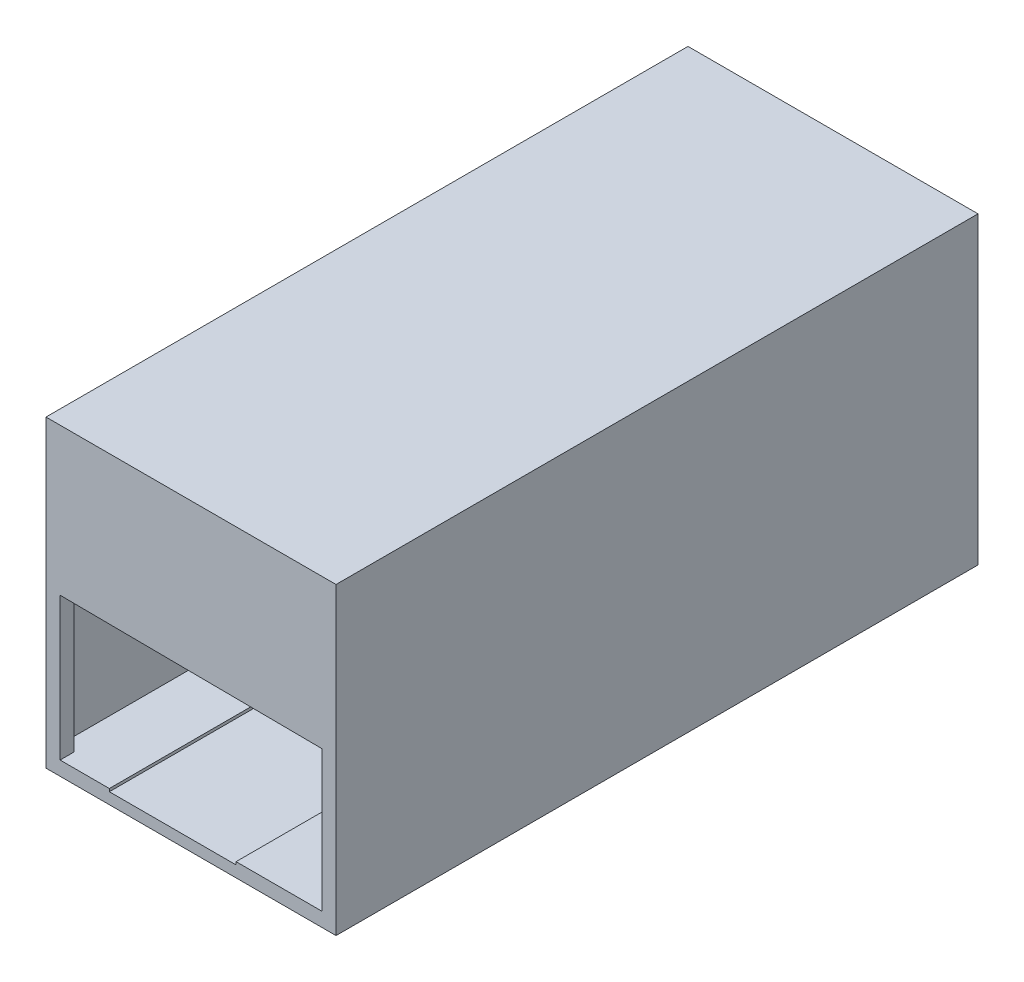
ISO-10303-21;
HEADER;
FILE_DESCRIPTION(('STEP AP214'),'2;1');
FILE_NAME('part.step','',(''),(''),'','','');
FILE_SCHEMA(('AUTOMOTIVE_DESIGN { 1 0 10303 214 1 1 1 1 }'));
ENDSEC;
DATA;
#1=APPLICATION_CONTEXT('core data for automotive mechanical design processes');
#2=APPLICATION_PROTOCOL_DEFINITION('international standard','automotive_design',2000,#1);
#3=PRODUCT_CONTEXT('',#1,'mechanical');
#4=PRODUCT('Part','Part','',(#3));
#5=PRODUCT_RELATED_PRODUCT_CATEGORY('part','',(#4));
#6=PRODUCT_DEFINITION_FORMATION('','',#4);
#7=PRODUCT_DEFINITION_CONTEXT('part definition',#1,'design');
#8=PRODUCT_DEFINITION('design','',#6,#7);
#9=PRODUCT_DEFINITION_SHAPE('','',#8);
#10=(LENGTH_UNIT() NAMED_UNIT(*) SI_UNIT(.MILLI.,.METRE.));
#11=(NAMED_UNIT(*) PLANE_ANGLE_UNIT() SI_UNIT($,.RADIAN.));
#12=(NAMED_UNIT(*) SI_UNIT($,.STERADIAN.) SOLID_ANGLE_UNIT());
#13=UNCERTAINTY_MEASURE_WITH_UNIT(LENGTH_MEASURE(1.E-05),#10,'distance_accuracy_value','');
#14=(GEOMETRIC_REPRESENTATION_CONTEXT(3) GLOBAL_UNCERTAINTY_ASSIGNED_CONTEXT((#13)) GLOBAL_UNIT_ASSIGNED_CONTEXT((#10,
#11,#12)) REPRESENTATION_CONTEXT('',''));
#15=CARTESIAN_POINT('',(0.,0.,0.));
#16=DIRECTION('',(0.,0.,1.));
#17=DIRECTION('',(1.,0.,0.));
#18=AXIS2_PLACEMENT_3D('',#15,#16,#17);
#19=CARTESIAN_POINT('',(-51.3,-49.,-369.882909471155));
#20=DIRECTION('',(0.,-1.,0.));
#21=DIRECTION('',(0.,0.,-1.));
#22=AXIS2_PLACEMENT_3D('',#19,#20,#21);
#23=PLANE('',#22);
#24=DIRECTION('',(1.,0.,0.));
#25=VECTOR('',#24,1.);
#26=CARTESIAN_POINT('',(0.,-49.,0.));
#27=LINE('',#26,#25);
#28=CARTESIAN_POINT('',(-46.5,-49.,0.));
#29=VERTEX_POINT('',#28);
#30=CARTESIAN_POINT('',(-29.,-49.,0.));
#31=VERTEX_POINT('',#30);
#32=EDGE_CURVE('E209',#29,#31,#27,.T.);
#33=ORIENTED_EDGE('',*,*,#32,.T.);
#34=DIRECTION('',(0.,0.,1.));
#35=VECTOR('',#34,1.);
#36=CARTESIAN_POINT('',(-29.,-49.,0.));
#37=LINE('',#36,#35);
#38=CARTESIAN_POINT('',(-29.,-49.,-228.));
#39=VERTEX_POINT('',#38);
#40=EDGE_CURVE('E390',#39,#31,#37,.T.);
#41=ORIENTED_EDGE('',*,*,#40,.F.);
#42=DIRECTION('',(-1.,0.,0.));
#43=VECTOR('',#42,1.);
#44=CARTESIAN_POINT('',(0.,-49.,-228.));
#45=LINE('',#44,#43);
#46=CARTESIAN_POINT('',(-46.5,-49.,-228.));
#47=VERTEX_POINT('',#46);
#48=EDGE_CURVE('E237',#39,#47,#45,.T.);
#49=ORIENTED_EDGE('',*,*,#48,.T.);
#50=DIRECTION('',(0.,0.,1.));
#51=VECTOR('',#50,1.);
#52=CARTESIAN_POINT('',(-46.5,-49.,-444.));
#53=LINE('',#52,#51);
#54=CARTESIAN_POINT('',(-46.5,-49.,-223.));
#55=VERTEX_POINT('',#54);
#56=EDGE_CURVE('E68',#47,#55,#53,.T.);
#57=ORIENTED_EDGE('',*,*,#56,.T.);
#58=DIRECTION('',(1.,0.,0.));
#59=VECTOR('',#58,1.);
#60=CARTESIAN_POINT('',(-51.3,-49.,-223.));
#61=LINE('',#60,#59);
#62=CARTESIAN_POINT('',(-51.3,-49.,-223.));
#63=VERTEX_POINT('',#62);
#64=EDGE_CURVE('E282',#63,#55,#61,.T.);
#65=ORIENTED_EDGE('',*,*,#64,.F.);
#66=DIRECTION('',(0.,0.,1.));
#67=VECTOR('',#66,1.);
#68=CARTESIAN_POINT('',(-51.3,-49.,-369.882909471155));
#69=LINE('',#68,#67);
#70=CARTESIAN_POINT('',(-51.3,-49.,-5.));
#71=VERTEX_POINT('',#70);
#72=EDGE_CURVE('E289',#63,#71,#69,.T.);
#73=ORIENTED_EDGE('',*,*,#72,.T.);
#74=DIRECTION('',(1.,0.,0.));
#75=VECTOR('',#74,1.);
#76=CARTESIAN_POINT('',(-51.3,-49.,-5.));
#77=LINE('',#76,#75);
#78=CARTESIAN_POINT('',(-46.5,-49.,-4.99999999999995));
#79=VERTEX_POINT('',#78);
#80=EDGE_CURVE('E276',#71,#79,#77,.T.);
#81=ORIENTED_EDGE('',*,*,#80,.T.);
#82=EDGE_CURVE('E221',#79,#29,#53,.T.);
#83=ORIENTED_EDGE('',*,*,#82,.T.);
#84=EDGE_LOOP('',(#33,#41,#49,#57,#65,#73,#81,#83));
#85=FACE_BOUND('',#84,.T.);
#86=ADVANCED_FACE('F43',(#85),#23,.F.);
#87=CARTESIAN_POINT('',(0.,0.,-223.));
#88=DIRECTION('',(0.,0.,-1.));
#89=DIRECTION('',(-1.,0.,0.));
#90=AXIS2_PLACEMENT_3D('',#87,#88,#89);
#91=PLANE('',#90);
#92=ORIENTED_EDGE('',*,*,#64,.T.);
#93=DIRECTION('',(0.,1.,0.));
#94=VECTOR('',#93,1.);
#95=CARTESIAN_POINT('',(-46.5,0.,-223.));
#96=LINE('',#95,#94);
#97=CARTESIAN_POINT('',(-46.5,1.70847564087544,-223.));
#98=VERTEX_POINT('',#97);
#99=EDGE_CURVE('E259',#55,#98,#96,.T.);
#100=ORIENTED_EDGE('',*,*,#99,.T.);
#101=DIRECTION('',(0.999970984166516,-0.00761779660069039,0.));
#102=VECTOR('',#101,1.);
#103=CARTESIAN_POINT('',(0.0103160089287741,1.3541592328997,-223.));
#104=LINE('',#103,#102);
#105=CARTESIAN_POINT('',(46.5,1.00000000000001,-223.));
#106=VERTEX_POINT('',#105);
#107=EDGE_CURVE('E251',#98,#106,#104,.T.);
#108=ORIENTED_EDGE('',*,*,#107,.T.);
#109=DIRECTION('',(0.,-1.,0.));
#110=VECTOR('',#109,1.);
#111=CARTESIAN_POINT('',(46.5,0.,-223.));
#112=LINE('',#111,#110);
#113=CARTESIAN_POINT('',(46.5,-49.,-223.));
#114=VERTEX_POINT('',#113);
#115=EDGE_CURVE('E243',#106,#114,#112,.T.);
#116=ORIENTED_EDGE('',*,*,#115,.T.);
#117=CARTESIAN_POINT('',(51.3,-49.,-223.));
#118=VERTEX_POINT('',#117);
#119=EDGE_CURVE('E272',#114,#118,#61,.T.);
#120=ORIENTED_EDGE('',*,*,#119,.T.);
#121=DIRECTION('',(0.,1.,0.));
#122=VECTOR('',#121,1.);
#123=CARTESIAN_POINT('',(51.3,-49.,-223.));
#124=LINE('',#123,#122);
#125=CARTESIAN_POINT('',(51.3,49.,-223.));
#126=VERTEX_POINT('',#125);
#127=EDGE_CURVE('E295',#118,#126,#124,.T.);
#128=ORIENTED_EDGE('',*,*,#127,.T.);
#129=DIRECTION('',(-1.,0.,0.));
#130=VECTOR('',#129,1.);
#131=CARTESIAN_POINT('',(-0.803988536882182,49.,-223.));
#132=LINE('',#131,#130);
#133=CARTESIAN_POINT('',(-51.3,49.,-223.));
#134=VERTEX_POINT('',#133);
#135=EDGE_CURVE('E291',#126,#134,#132,.T.);
#136=ORIENTED_EDGE('',*,*,#135,.T.);
#137=DIRECTION('',(0.,-1.,0.));
#138=VECTOR('',#137,1.);
#139=CARTESIAN_POINT('',(-51.3,49.,-223.));
#140=LINE('',#139,#138);
#141=EDGE_CURVE('E286',#134,#63,#140,.T.);
#142=ORIENTED_EDGE('',*,*,#141,.T.);
#143=EDGE_LOOP('',(#92,#100,#108,#116,#120,#128,#136,#142));
#144=FACE_BOUND('',#143,.T.);
#145=ADVANCED_FACE('F357',(#144),#91,.F.);
#146=CARTESIAN_POINT('',(0.,0.,-5.));
#147=DIRECTION('',(0.,0.,1.));
#148=DIRECTION('',(1.,0.,0.));
#149=AXIS2_PLACEMENT_3D('',#146,#147,#148);
#150=PLANE('',#149);
#151=DIRECTION('',(-0.999970984166516,0.00761779660069039,0.));
#152=VECTOR('',#151,1.);
#153=CARTESIAN_POINT('',(0.0103160089287741,1.3541592328997,-5.));
#154=LINE('',#153,#152);
#155=CARTESIAN_POINT('',(46.5,1.00000000000001,-5.));
#156=VERTEX_POINT('',#155);
#157=CARTESIAN_POINT('',(-46.5,1.70847564087544,-5.));
#158=VERTEX_POINT('',#157);
#159=EDGE_CURVE('E248',#156,#158,#154,.T.);
#160=ORIENTED_EDGE('',*,*,#159,.T.);
#161=DIRECTION('',(0.,-1.,0.));
#162=VECTOR('',#161,1.);
#163=CARTESIAN_POINT('',(-46.5,0.,-5.));
#164=LINE('',#163,#162);
#165=EDGE_CURVE('E256',#158,#79,#164,.T.);
#166=ORIENTED_EDGE('',*,*,#165,.T.);
#167=ORIENTED_EDGE('',*,*,#80,.F.);
#168=DIRECTION('',(0.,-1.,0.));
#169=VECTOR('',#168,1.);
#170=CARTESIAN_POINT('',(-51.3,49.,-5.));
#171=LINE('',#170,#169);
#172=CARTESIAN_POINT('',(-51.3,49.,-5.));
#173=VERTEX_POINT('',#172);
#174=EDGE_CURVE('E266',#173,#71,#171,.T.);
#175=ORIENTED_EDGE('',*,*,#174,.F.);
#176=DIRECTION('',(-1.,0.,0.));
#177=VECTOR('',#176,1.);
#178=CARTESIAN_POINT('',(-0.803988536882182,49.,-5.));
#179=LINE('',#178,#177);
#180=CARTESIAN_POINT('',(51.3,49.,-5.));
#181=VERTEX_POINT('',#180);
#182=EDGE_CURVE('E269',#181,#173,#179,.T.);
#183=ORIENTED_EDGE('',*,*,#182,.F.);
#184=DIRECTION('',(0.,1.,0.));
#185=VECTOR('',#184,1.);
#186=CARTESIAN_POINT('',(51.3,-49.,-5.));
#187=LINE('',#186,#185);
#188=CARTESIAN_POINT('',(51.3,-49.,-5.));
#189=VERTEX_POINT('',#188);
#190=EDGE_CURVE('E273',#189,#181,#187,.T.);
#191=ORIENTED_EDGE('',*,*,#190,.F.);
#192=CARTESIAN_POINT('',(46.5,-49.,-5.));
#193=VERTEX_POINT('',#192);
#194=EDGE_CURVE('E279',#193,#189,#77,.T.);
#195=ORIENTED_EDGE('',*,*,#194,.F.);
#196=DIRECTION('',(0.,1.,0.));
#197=VECTOR('',#196,1.);
#198=CARTESIAN_POINT('',(46.5,0.,-5.));
#199=LINE('',#198,#197);
#200=EDGE_CURVE('E240',#193,#156,#199,.T.);
#201=ORIENTED_EDGE('',*,*,#200,.T.);
#202=EDGE_LOOP('',(#160,#166,#167,#175,#183,#191,#195,#201));
#203=FACE_BOUND('',#202,.T.);
#204=ADVANCED_FACE('F365',(#203),#150,.F.);
#205=CARTESIAN_POINT('',(46.5,-49.,-228.));
#206=VERTEX_POINT('',#205);
#207=CARTESIAN_POINT('',(16.,-49.,-228.));
#208=VERTEX_POINT('',#207);
#209=EDGE_CURVE('E233',#206,#208,#45,.T.);
#210=ORIENTED_EDGE('',*,*,#209,.T.);
#211=DIRECTION('',(0.,0.,-1.));
#212=VECTOR('',#211,1.);
#213=CARTESIAN_POINT('',(16.,-49.,-228.));
#214=LINE('',#213,#212);
#215=CARTESIAN_POINT('',(16.,-49.,0.));
#216=VERTEX_POINT('',#215);
#217=EDGE_CURVE('E381',#216,#208,#214,.T.);
#218=ORIENTED_EDGE('',*,*,#217,.F.);
#219=CARTESIAN_POINT('',(46.5,-49.,0.));
#220=VERTEX_POINT('',#219);
#221=EDGE_CURVE('E201',#216,#220,#27,.T.);
#222=ORIENTED_EDGE('',*,*,#221,.T.);
#223=DIRECTION('',(0.,0.,1.));
#224=VECTOR('',#223,1.);
#225=CARTESIAN_POINT('',(46.5,-49.,-444.));
#226=LINE('',#225,#224);
#227=EDGE_CURVE('E220',#193,#220,#226,.T.);
#228=ORIENTED_EDGE('',*,*,#227,.F.);
#229=ORIENTED_EDGE('',*,*,#194,.T.);
#230=DIRECTION('',(0.,0.,1.));
#231=VECTOR('',#230,1.);
#232=CARTESIAN_POINT('',(51.3,-49.,-369.882909471155));
#233=LINE('',#232,#231);
#234=EDGE_CURVE('E285',#118,#189,#233,.T.);
#235=ORIENTED_EDGE('',*,*,#234,.F.);
#236=ORIENTED_EDGE('',*,*,#119,.F.);
#237=EDGE_CURVE('E230',#206,#114,#226,.T.);
#238=ORIENTED_EDGE('',*,*,#237,.F.);
#239=EDGE_LOOP('',(#210,#218,#222,#228,#229,#235,#236,#238));
#240=FACE_BOUND('',#239,.T.);
#241=ADVANCED_FACE('F359',(#240),#23,.F.);
#242=CARTESIAN_POINT('',(51.3,-49.,-369.882909471155));
#243=DIRECTION('',(1.,0.,0.));
#244=DIRECTION('',(0.,0.,-1.));
#245=AXIS2_PLACEMENT_3D('',#242,#243,#244);
#246=PLANE('',#245);
#247=ORIENTED_EDGE('',*,*,#234,.T.);
#248=ORIENTED_EDGE('',*,*,#190,.T.);
#249=DIRECTION('',(0.,0.,1.));
#250=VECTOR('',#249,1.);
#251=CARTESIAN_POINT('',(51.3,49.,-369.882909471155));
#252=LINE('',#251,#250);
#253=EDGE_CURVE('E294',#126,#181,#252,.T.);
#254=ORIENTED_EDGE('',*,*,#253,.F.);
#255=ORIENTED_EDGE('',*,*,#127,.F.);
#256=EDGE_LOOP('',(#247,#248,#254,#255));
#257=FACE_BOUND('',#256,.T.);
#258=ADVANCED_FACE('F369',(#257),#246,.F.);
#259=CARTESIAN_POINT('',(-0.803988536882182,49.,-369.882909471155));
#260=DIRECTION('',(0.,1.,0.));
#261=DIRECTION('',(0.,0.,1.));
#262=AXIS2_PLACEMENT_3D('',#259,#260,#261);
#263=PLANE('',#262);
#264=ORIENTED_EDGE('',*,*,#253,.T.);
#265=ORIENTED_EDGE('',*,*,#182,.T.);
#266=DIRECTION('',(0.,0.,1.));
#267=VECTOR('',#266,1.);
#268=CARTESIAN_POINT('',(-51.3,49.,-369.882909471155));
#269=LINE('',#268,#267);
#270=EDGE_CURVE('E290',#134,#173,#269,.T.);
#271=ORIENTED_EDGE('',*,*,#270,.F.);
#272=ORIENTED_EDGE('',*,*,#135,.F.);
#273=EDGE_LOOP('',(#264,#265,#271,#272));
#274=FACE_BOUND('',#273,.T.);
#275=ADVANCED_FACE('F375',(#274),#263,.F.);
#276=CARTESIAN_POINT('',(-51.3,49.,-369.882909471155));
#277=DIRECTION('',(-1.,0.,0.));
#278=DIRECTION('',(0.,0.,1.));
#279=AXIS2_PLACEMENT_3D('',#276,#277,#278);
#280=PLANE('',#279);
#281=CARTESIAN_POINT('',(-51.3,5.82000000000001,-114.));
#282=DIRECTION('',(-1.,0.,0.));
#283=DIRECTION('',(0.,0.,1.));
#284=AXIS2_PLACEMENT_3D('',#281,#282,#283);
#285=CIRCLE('',#284,23.5);
#286=CARTESIAN_POINT('',(-51.3,5.82000000000001,-90.5));
#287=VERTEX_POINT('',#286);
#288=EDGE_CURVE('E263',#287,#287,#285,.F.);
#289=ORIENTED_EDGE('',*,*,#288,.F.);
#290=EDGE_LOOP('',(#289));
#291=FACE_BOUND('',#290,.T.);
#292=ORIENTED_EDGE('',*,*,#270,.T.);
#293=ORIENTED_EDGE('',*,*,#174,.T.);
#294=ORIENTED_EDGE('',*,*,#72,.F.);
#295=ORIENTED_EDGE('',*,*,#141,.F.);
#296=EDGE_LOOP('',(#292,#293,#294,#295));
#297=FACE_BOUND('',#296,.T.);
#298=ADVANCED_FACE('F441',(#291,#297),#280,.F.);
#299=CARTESIAN_POINT('',(51.5,-54.,-228.));
#300=DIRECTION('',(1.,0.,0.));
#301=DIRECTION('',(0.,0.,-1.));
#302=AXIS2_PLACEMENT_3D('',#299,#300,#301);
#303=PLANE('',#302);
#304=DIRECTION('',(0.,1.,0.));
#305=VECTOR('',#304,1.);
#306=CARTESIAN_POINT('',(51.5,-54.,0.));
#307=LINE('',#306,#305);
#308=CARTESIAN_POINT('',(51.5,-54.,0.));
#309=VERTEX_POINT('',#308);
#310=CARTESIAN_POINT('',(51.5,54.,0.));
#311=VERTEX_POINT('',#310);
#312=EDGE_CURVE('E303',#309,#311,#307,.T.);
#313=ORIENTED_EDGE('',*,*,#312,.F.);
#314=DIRECTION('',(0.,0.,1.));
#315=VECTOR('',#314,1.);
#316=CARTESIAN_POINT('',(51.5,-54.,-228.));
#317=LINE('',#316,#315);
#318=CARTESIAN_POINT('',(51.5,-54.,-228.));
#319=VERTEX_POINT('',#318);
#320=EDGE_CURVE('E12',#319,#309,#317,.T.);
#321=ORIENTED_EDGE('',*,*,#320,.F.);
#322=DIRECTION('',(0.,1.,0.));
#323=VECTOR('',#322,1.);
#324=CARTESIAN_POINT('',(51.5,-54.,-228.));
#325=LINE('',#324,#323);
#326=CARTESIAN_POINT('',(51.5,54.,-228.));
#327=VERTEX_POINT('',#326);
#328=EDGE_CURVE('E304',#319,#327,#325,.T.);
#329=ORIENTED_EDGE('',*,*,#328,.T.);
#330=DIRECTION('',(0.,0.,1.));
#331=VECTOR('',#330,1.);
#332=CARTESIAN_POINT('',(51.5,54.,-228.));
#333=LINE('',#332,#331);
#334=EDGE_CURVE('E47',#327,#311,#333,.T.);
#335=ORIENTED_EDGE('',*,*,#334,.T.);
#336=EDGE_LOOP('',(#313,#321,#329,#335));
#337=FACE_BOUND('',#336,.T.);
#338=ADVANCED_FACE('F45',(#337),#303,.T.);
#339=CARTESIAN_POINT('',(-51.5,-54.,-228.));
#340=DIRECTION('',(0.,-1.,0.));
#341=DIRECTION('',(0.,0.,-1.));
#342=AXIS2_PLACEMENT_3D('',#339,#340,#341);
#343=PLANE('',#342);
#344=DIRECTION('',(1.,0.,0.));
#345=VECTOR('',#344,1.);
#346=CARTESIAN_POINT('',(-51.5,-54.,0.));
#347=LINE('',#346,#345);
#348=CARTESIAN_POINT('',(-51.5,-54.,0.));
#349=VERTEX_POINT('',#348);
#350=EDGE_CURVE('E308',#349,#309,#347,.T.);
#351=ORIENTED_EDGE('',*,*,#350,.F.);
#352=DIRECTION('',(0.,0.,1.));
#353=VECTOR('',#352,1.);
#354=CARTESIAN_POINT('',(-51.5,-54.,-228.));
#355=LINE('',#354,#353);
#356=CARTESIAN_POINT('',(-51.5,-54.,-228.));
#357=VERTEX_POINT('',#356);
#358=EDGE_CURVE('E52',#357,#349,#355,.T.);
#359=ORIENTED_EDGE('',*,*,#358,.F.);
#360=DIRECTION('',(1.,0.,0.));
#361=VECTOR('',#360,1.);
#362=CARTESIAN_POINT('',(-51.5,-54.,-228.));
#363=LINE('',#362,#361);
#364=EDGE_CURVE('E314',#357,#319,#363,.T.);
#365=ORIENTED_EDGE('',*,*,#364,.T.);
#366=ORIENTED_EDGE('',*,*,#320,.T.);
#367=EDGE_LOOP('',(#351,#359,#365,#366));
#368=FACE_BOUND('',#367,.T.);
#369=ADVANCED_FACE('F338',(#368),#343,.T.);
#370=CARTESIAN_POINT('',(-51.5,-54.,-228.));
#371=DIRECTION('',(-1.,0.,0.));
#372=DIRECTION('',(0.,0.,1.));
#373=AXIS2_PLACEMENT_3D('',#370,#371,#372);
#374=PLANE('',#373);
#375=CARTESIAN_POINT('',(-51.5,5.82000000000001,-114.));
#376=DIRECTION('',(-1.,0.,0.));
#377=DIRECTION('',(0.,0.,1.));
#378=AXIS2_PLACEMENT_3D('',#375,#376,#377);
#379=CIRCLE('',#378,23.5);
#380=CARTESIAN_POINT('',(-51.5,5.82000000000001,-90.5));
#381=VERTEX_POINT('',#380);
#382=EDGE_CURVE('E262',#381,#381,#379,.T.);
#383=ORIENTED_EDGE('',*,*,#382,.F.);
#384=EDGE_LOOP('',(#383));
#385=FACE_BOUND('',#384,.T.);
#386=DIRECTION('',(0.,-1.,0.));
#387=VECTOR('',#386,1.);
#388=CARTESIAN_POINT('',(-51.5,-54.,0.));
#389=LINE('',#388,#387);
#390=CARTESIAN_POINT('',(-51.5,54.,0.));
#391=VERTEX_POINT('',#390);
#392=EDGE_CURVE('E322',#391,#349,#389,.T.);
#393=ORIENTED_EDGE('',*,*,#392,.F.);
#394=DIRECTION('',(0.,0.,1.));
#395=VECTOR('',#394,1.);
#396=CARTESIAN_POINT('',(-51.5,54.,-228.));
#397=LINE('',#396,#395);
#398=CARTESIAN_POINT('',(-51.5,54.,-228.));
#399=VERTEX_POINT('',#398);
#400=EDGE_CURVE('E327',#399,#391,#397,.T.);
#401=ORIENTED_EDGE('',*,*,#400,.F.);
#402=DIRECTION('',(0.,-1.,0.));
#403=VECTOR('',#402,1.);
#404=CARTESIAN_POINT('',(-51.5,-54.,-228.));
#405=LINE('',#404,#403);
#406=EDGE_CURVE('E311',#399,#357,#405,.T.);
#407=ORIENTED_EDGE('',*,*,#406,.T.);
#408=ORIENTED_EDGE('',*,*,#358,.T.);
#409=EDGE_LOOP('',(#393,#401,#407,#408));
#410=FACE_BOUND('',#409,.T.);
#411=ADVANCED_FACE('F344',(#385,#410),#374,.T.);
#412=CARTESIAN_POINT('',(-51.5,54.,-228.));
#413=DIRECTION('',(0.,1.,0.));
#414=DIRECTION('',(0.,0.,1.));
#415=AXIS2_PLACEMENT_3D('',#412,#413,#414);
#416=PLANE('',#415);
#417=DIRECTION('',(-1.,0.,0.));
#418=VECTOR('',#417,1.);
#419=CARTESIAN_POINT('',(-51.5,54.,0.));
#420=LINE('',#419,#418);
#421=EDGE_CURVE('E319',#311,#391,#420,.T.);
#422=ORIENTED_EDGE('',*,*,#421,.F.);
#423=ORIENTED_EDGE('',*,*,#334,.F.);
#424=DIRECTION('',(-1.,0.,0.));
#425=VECTOR('',#424,1.);
#426=CARTESIAN_POINT('',(-51.5,54.,-228.));
#427=LINE('',#426,#425);
#428=EDGE_CURVE('E307',#327,#399,#427,.T.);
#429=ORIENTED_EDGE('',*,*,#428,.T.);
#430=ORIENTED_EDGE('',*,*,#400,.T.);
#431=EDGE_LOOP('',(#422,#423,#429,#430));
#432=FACE_BOUND('',#431,.T.);
#433=ADVANCED_FACE('F335',(#432),#416,.T.);
#434=CARTESIAN_POINT('',(0.,0.,-228.));
#435=DIRECTION('',(0.,0.,-1.));
#436=DIRECTION('',(-1.,0.,0.));
#437=AXIS2_PLACEMENT_3D('',#434,#435,#436);
#438=PLANE('',#437);
#439=DIRECTION('',(0.,1.,0.));
#440=VECTOR('',#439,1.);
#441=CARTESIAN_POINT('',(-29.,-50.,-228.));
#442=LINE('',#441,#440);
#443=CARTESIAN_POINT('',(-29.,-50.,-228.));
#444=VERTEX_POINT('',#443);
#445=EDGE_CURVE('E204',#444,#39,#442,.T.);
#446=ORIENTED_EDGE('',*,*,#445,.F.);
#447=DIRECTION('',(-1.,0.,0.));
#448=VECTOR('',#447,1.);
#449=CARTESIAN_POINT('',(11.,-50.,-228.));
#450=LINE('',#449,#448);
#451=CARTESIAN_POINT('',(16.,-50.,-228.));
#452=VERTEX_POINT('',#451);
#453=EDGE_CURVE('E189',#452,#444,#450,.T.);
#454=ORIENTED_EDGE('',*,*,#453,.F.);
#455=DIRECTION('',(0.,1.,0.));
#456=VECTOR('',#455,1.);
#457=CARTESIAN_POINT('',(16.,-50.,-228.));
#458=LINE('',#457,#456);
#459=EDGE_CURVE('E187',#452,#208,#458,.T.);
#460=ORIENTED_EDGE('',*,*,#459,.T.);
#461=ORIENTED_EDGE('',*,*,#209,.F.);
#462=DIRECTION('',(0.,-1.,0.));
#463=VECTOR('',#462,1.);
#464=CARTESIAN_POINT('',(46.5,0.,-228.));
#465=LINE('',#464,#463);
#466=CARTESIAN_POINT('',(46.5,1.00000000000001,-228.));
#467=VERTEX_POINT('',#466);
#468=EDGE_CURVE('E236',#467,#206,#465,.T.);
#469=ORIENTED_EDGE('',*,*,#468,.F.);
#470=DIRECTION('',(0.999970984166516,-0.00761779660069039,0.));
#471=VECTOR('',#470,1.);
#472=CARTESIAN_POINT('',(0.0103160089287741,1.3541592328997,-228.));
#473=LINE('',#472,#471);
#474=CARTESIAN_POINT('',(-46.5,1.70847564087544,-228.));
#475=VERTEX_POINT('',#474);
#476=EDGE_CURVE('E246',#475,#467,#473,.T.);
#477=ORIENTED_EDGE('',*,*,#476,.F.);
#478=DIRECTION('',(0.,1.,0.));
#479=VECTOR('',#478,1.);
#480=CARTESIAN_POINT('',(-46.5,0.,-228.));
#481=LINE('',#480,#479);
#482=EDGE_CURVE('E254',#47,#475,#481,.T.);
#483=ORIENTED_EDGE('',*,*,#482,.F.);
#484=ORIENTED_EDGE('',*,*,#48,.F.);
#485=EDGE_LOOP('',(#446,#454,#460,#461,#469,#477,#483,#484));
#486=FACE_BOUND('',#485,.T.);
#487=ORIENTED_EDGE('',*,*,#328,.F.);
#488=ORIENTED_EDGE('',*,*,#364,.F.);
#489=ORIENTED_EDGE('',*,*,#406,.F.);
#490=ORIENTED_EDGE('',*,*,#428,.F.);
#491=EDGE_LOOP('',(#487,#488,#489,#490));
#492=FACE_BOUND('',#491,.T.);
#493=ADVANCED_FACE('F341',(#486,#492),#438,.T.);
#494=CARTESIAN_POINT('',(0.,0.,0.));
#495=DIRECTION('',(0.,0.,-1.));
#496=DIRECTION('',(-1.,0.,0.));
#497=AXIS2_PLACEMENT_3D('',#494,#495,#496);
#498=PLANE('',#497);
#499=DIRECTION('',(1.,0.,0.));
#500=VECTOR('',#499,1.);
#501=CARTESIAN_POINT('',(16.,-50.,0.));
#502=LINE('',#501,#500);
#503=CARTESIAN_POINT('',(-29.,-50.,0.));
#504=VERTEX_POINT('',#503);
#505=CARTESIAN_POINT('',(16.,-50.,0.));
#506=VERTEX_POINT('',#505);
#507=EDGE_CURVE('E190',#504,#506,#502,.T.);
#508=ORIENTED_EDGE('',*,*,#507,.F.);
#509=DIRECTION('',(0.,1.,0.));
#510=VECTOR('',#509,1.);
#511=CARTESIAN_POINT('',(-29.,-50.,0.));
#512=LINE('',#511,#510);
#513=EDGE_CURVE('E202',#504,#31,#512,.T.);
#514=ORIENTED_EDGE('',*,*,#513,.T.);
#515=ORIENTED_EDGE('',*,*,#32,.F.);
#516=DIRECTION('',(0.,-1.,0.));
#517=VECTOR('',#516,1.);
#518=CARTESIAN_POINT('',(-46.5,1.70847564087544,0.));
#519=LINE('',#518,#517);
#520=CARTESIAN_POINT('',(-46.5,1.70847564087544,0.));
#521=VERTEX_POINT('',#520);
#522=EDGE_CURVE('E218',#521,#29,#519,.T.);
#523=ORIENTED_EDGE('',*,*,#522,.F.);
#524=DIRECTION('',(-0.999970984166516,0.00761779660069039,0.));
#525=VECTOR('',#524,1.);
#526=CARTESIAN_POINT('',(-46.5,1.70847564087544,0.));
#527=LINE('',#526,#525);
#528=CARTESIAN_POINT('',(46.5,1.00000000000001,0.));
#529=VERTEX_POINT('',#528);
#530=EDGE_CURVE('E215',#529,#521,#527,.T.);
#531=ORIENTED_EDGE('',*,*,#530,.F.);
#532=DIRECTION('',(0.,1.,0.));
#533=VECTOR('',#532,1.);
#534=CARTESIAN_POINT('',(46.5,-49.,0.));
#535=LINE('',#534,#533);
#536=EDGE_CURVE('E212',#220,#529,#535,.T.);
#537=ORIENTED_EDGE('',*,*,#536,.F.);
#538=ORIENTED_EDGE('',*,*,#221,.F.);
#539=DIRECTION('',(0.,1.,0.));
#540=VECTOR('',#539,1.);
#541=CARTESIAN_POINT('',(16.,-50.,0.));
#542=LINE('',#541,#540);
#543=EDGE_CURVE('E184',#506,#216,#542,.T.);
#544=ORIENTED_EDGE('',*,*,#543,.F.);
#545=EDGE_LOOP('',(#508,#514,#515,#523,#531,#537,#538,#544));
#546=FACE_BOUND('',#545,.T.);
#547=ORIENTED_EDGE('',*,*,#312,.T.);
#548=ORIENTED_EDGE('',*,*,#421,.T.);
#549=ORIENTED_EDGE('',*,*,#392,.T.);
#550=ORIENTED_EDGE('',*,*,#350,.T.);
#551=EDGE_LOOP('',(#547,#548,#549,#550));
#552=FACE_BOUND('',#551,.T.);
#553=ADVANCED_FACE('F198',(#546,#552),#498,.F.);
#554=CARTESIAN_POINT('',(51.501,5.82000000000001,-114.));
#555=DIRECTION('',(-1.,0.,0.));
#556=DIRECTION('',(0.,0.,1.));
#557=AXIS2_PLACEMENT_3D('',#554,#555,#556);
#558=CYLINDRICAL_SURFACE('',#557,23.5);
#559=CARTESIAN_POINT('',(-51.5,5.82000000000001,-90.5));
#560=CARTESIAN_POINT('',(-51.4979166666666,5.82000000000001,-90.5));
#561=CARTESIAN_POINT('',(-51.4958333333333,5.82000000000001,-90.5));
#562=CARTESIAN_POINT('',(-51.4916666666667,5.82000000000001,-90.5));
#563=CARTESIAN_POINT('',(-51.4895833333333,5.82000000000001,-90.5));
#564=CARTESIAN_POINT('',(-51.4854166666667,5.82000000000001,-90.5));
#565=CARTESIAN_POINT('',(-51.4833333333333,5.82000000000001,-90.5));
#566=CARTESIAN_POINT('',(-51.4791666666667,5.82000000000001,-90.5));
#567=CARTESIAN_POINT('',(-51.4770833333333,5.82000000000001,-90.5));
#568=CARTESIAN_POINT('',(-51.4729166666667,5.82000000000001,-90.5));
#569=CARTESIAN_POINT('',(-51.4708333333333,5.82000000000001,-90.5));
#570=CARTESIAN_POINT('',(-51.4666666666667,5.82000000000001,-90.5));
#571=CARTESIAN_POINT('',(-51.4645833333333,5.82000000000001,-90.5));
#572=CARTESIAN_POINT('',(-51.4604166666667,5.82000000000001,-90.5));
#573=CARTESIAN_POINT('',(-51.4583333333333,5.82000000000001,-90.5));
#574=CARTESIAN_POINT('',(-51.4541666666667,5.82000000000001,-90.5));
#575=CARTESIAN_POINT('',(-51.4520833333333,5.82000000000001,-90.5));
#576=CARTESIAN_POINT('',(-51.4479166666667,5.82000000000001,-90.5));
#577=CARTESIAN_POINT('',(-51.4458333333333,5.82000000000001,-90.5));
#578=CARTESIAN_POINT('',(-51.4416666666667,5.82000000000001,-90.5));
#579=CARTESIAN_POINT('',(-51.4395833333333,5.82000000000001,-90.5));
#580=CARTESIAN_POINT('',(-51.4354166666667,5.82000000000001,-90.5));
#581=CARTESIAN_POINT('',(-51.4333333333333,5.82000000000001,-90.5));
#582=CARTESIAN_POINT('',(-51.4291666666667,5.82000000000001,-90.5));
#583=CARTESIAN_POINT('',(-51.4270833333333,5.82000000000001,-90.5));
#584=CARTESIAN_POINT('',(-51.4229166666667,5.82000000000001,-90.5));
#585=CARTESIAN_POINT('',(-51.4208333333333,5.82000000000001,-90.5));
#586=CARTESIAN_POINT('',(-51.4166666666667,5.82000000000001,-90.5));
#587=CARTESIAN_POINT('',(-51.4145833333333,5.82000000000001,-90.5));
#588=CARTESIAN_POINT('',(-51.4104166666667,5.82000000000001,-90.5));
#589=CARTESIAN_POINT('',(-51.4083333333333,5.82000000000001,-90.5));
#590=CARTESIAN_POINT('',(-51.4041666666667,5.82000000000001,-90.5));
#591=CARTESIAN_POINT('',(-51.4020833333333,5.82000000000001,-90.5));
#592=CARTESIAN_POINT('',(-51.3979166666667,5.82000000000001,-90.5));
#593=CARTESIAN_POINT('',(-51.3958333333333,5.82000000000001,-90.5));
#594=CARTESIAN_POINT('',(-51.3916666666667,5.82000000000001,-90.5));
#595=CARTESIAN_POINT('',(-51.3895833333333,5.82000000000001,-90.5));
#596=CARTESIAN_POINT('',(-51.3854166666667,5.82000000000001,-90.5));
#597=CARTESIAN_POINT('',(-51.3833333333333,5.82000000000001,-90.5));
#598=CARTESIAN_POINT('',(-51.3791666666667,5.82000000000001,-90.5));
#599=CARTESIAN_POINT('',(-51.3770833333333,5.82000000000001,-90.5));
#600=CARTESIAN_POINT('',(-51.3729166666667,5.82000000000001,-90.5));
#601=CARTESIAN_POINT('',(-51.3708333333333,5.82000000000001,-90.5));
#602=CARTESIAN_POINT('',(-51.3666666666667,5.82000000000001,-90.5));
#603=CARTESIAN_POINT('',(-51.3645833333333,5.82000000000001,-90.5));
#604=CARTESIAN_POINT('',(-51.3604166666667,5.82000000000001,-90.5));
#605=CARTESIAN_POINT('',(-51.3583333333333,5.82000000000001,-90.5));
#606=CARTESIAN_POINT('',(-51.3541666666667,5.82000000000001,-90.5));
#607=CARTESIAN_POINT('',(-51.3520833333333,5.82000000000001,-90.5));
#608=CARTESIAN_POINT('',(-51.3479166666667,5.82000000000001,-90.5));
#609=CARTESIAN_POINT('',(-51.3458333333333,5.82000000000001,-90.5));
#610=CARTESIAN_POINT('',(-51.3416666666667,5.82000000000001,-90.5));
#611=CARTESIAN_POINT('',(-51.3395833333333,5.82000000000001,-90.5));
#612=CARTESIAN_POINT('',(-51.3354166666667,5.82000000000001,-90.5));
#613=CARTESIAN_POINT('',(-51.3333333333333,5.82000000000001,-90.5));
#614=CARTESIAN_POINT('',(-51.3291666666667,5.82000000000001,-90.5));
#615=CARTESIAN_POINT('',(-51.3270833333333,5.82000000000001,-90.5));
#616=CARTESIAN_POINT('',(-51.3229166666667,5.82000000000001,-90.5));
#617=CARTESIAN_POINT('',(-51.3208333333333,5.82000000000001,-90.5));
#618=CARTESIAN_POINT('',(-51.3166666666667,5.82000000000001,-90.5));
#619=CARTESIAN_POINT('',(-51.3145833333333,5.82000000000001,-90.5));
#620=CARTESIAN_POINT('',(-51.3104166666667,5.82000000000001,-90.5));
#621=CARTESIAN_POINT('',(-51.3083333333333,5.82000000000001,-90.5));
#622=CARTESIAN_POINT('',(-51.3041666666667,5.82000000000001,-90.5));
#623=CARTESIAN_POINT('',(-51.3020833333333,5.82000000000001,-90.5));
#624=CARTESIAN_POINT('',(-51.3,5.82000000000001,-90.5));
#625=B_SPLINE_CURVE_WITH_KNOTS('',3,(#559,#560,#561,#562,#563,#564,#565,#566,#567,#568,#569,
#570,#571,#572,#573,#574,#575,#576,#577,#578,#579,#580,#581,#582,#583,#584,#585,#586,#587,#588,
#589,#590,#591,#592,#593,#594,#595,#596,#597,#598,#599,#600,#601,#602,#603,#604,#605,#606,#607,
#608,#609,#610,#611,#612,#613,#614,#615,#616,#617,#618,#619,#620,#621,#622,#623,#624),
.UNSPECIFIED.,.F.,.F.,(4,2,2,2,2,2,2,2,2,2,2,2,2,2,2,2,2,2,2,2,2,2,2,2,2,2,2,2,2,2,2,2,4),(0.,
0.00624999999999931,0.0124999999999986,0.0187499999999979,0.0249999999999972,0.0312499999999966,
0.0374999999999959,0.0437499999999952,0.0499999999999945,0.0562499999999938,0.0624999999999931,
0.0687499999999924,0.0749999999999917,0.0812499999999911,0.0874999999999904,0.0937499999999897,
0.099999999999989,0.106249999999988,0.112499999999988,0.118749999999987,0.124999999999986,
0.131249999999986,0.137499999999985,0.143749999999984,0.149999999999983,0.156249999999983,
0.162499999999982,0.168749999999981,0.174999999999981,0.18124999999998,0.187499999999979,
0.193749999999979,0.199999999999978),.UNSPECIFIED.);
#626=EDGE_CURVE('BSEAM438',#381,#287,#625,.T.);
#627=ORIENTED_EDGE('',*,*,#382,.T.);
#628=ORIENTED_EDGE('',*,*,#288,.T.);
#629=ORIENTED_EDGE('',*,*,#626,.T.);
#630=ORIENTED_EDGE('',*,*,#626,.F.);
#631=EDGE_LOOP('',(#627,#629,#628,#630));
#632=FACE_BOUND('',#631,.T.);
#633=ADVANCED_FACE('F438',(#632),#558,.F.);
#634=CARTESIAN_POINT('',(46.5,-49.,-444.));
#635=DIRECTION('',(1.,0.,0.));
#636=DIRECTION('',(0.,0.,-1.));
#637=AXIS2_PLACEMENT_3D('',#634,#635,#636);
#638=PLANE('',#637);
#639=ORIENTED_EDGE('',*,*,#227,.T.);
#640=ORIENTED_EDGE('',*,*,#536,.T.);
#641=DIRECTION('',(0.,0.,1.));
#642=VECTOR('',#641,1.);
#643=CARTESIAN_POINT('',(46.5,1.00000000000001,-444.));
#644=LINE('',#643,#642);
#645=EDGE_CURVE('E228',#156,#529,#644,.T.);
#646=ORIENTED_EDGE('',*,*,#645,.F.);
#647=ORIENTED_EDGE('',*,*,#200,.F.);
#648=EDGE_LOOP('',(#639,#640,#646,#647));
#649=FACE_BOUND('',#648,.T.);
#650=ADVANCED_FACE('F396',(#649),#638,.F.);
#651=CARTESIAN_POINT('',(-46.5,1.70847564087544,-444.));
#652=DIRECTION('',(0.00761779660069039,0.999970984166516,0.));
#653=DIRECTION('',(-0.999970984166516,0.00761779660069039,0.));
#654=AXIS2_PLACEMENT_3D('',#651,#652,#653);
#655=PLANE('',#654);
#656=ORIENTED_EDGE('',*,*,#645,.T.);
#657=ORIENTED_EDGE('',*,*,#530,.T.);
#658=DIRECTION('',(0.,0.,1.));
#659=VECTOR('',#658,1.);
#660=CARTESIAN_POINT('',(-46.5,1.70847564087544,-444.));
#661=LINE('',#660,#659);
#662=EDGE_CURVE('E225',#158,#521,#661,.T.);
#663=ORIENTED_EDGE('',*,*,#662,.F.);
#664=ORIENTED_EDGE('',*,*,#159,.F.);
#665=EDGE_LOOP('',(#656,#657,#663,#664));
#666=FACE_BOUND('',#665,.T.);
#667=ADVANCED_FACE('F404',(#666),#655,.F.);
#668=CARTESIAN_POINT('',(-46.5,1.70847564087544,-444.));
#669=DIRECTION('',(-1.,0.,0.));
#670=DIRECTION('',(0.,0.,1.));
#671=AXIS2_PLACEMENT_3D('',#668,#669,#670);
#672=PLANE('',#671);
#673=ORIENTED_EDGE('',*,*,#662,.T.);
#674=ORIENTED_EDGE('',*,*,#522,.T.);
#675=ORIENTED_EDGE('',*,*,#82,.F.);
#676=ORIENTED_EDGE('',*,*,#165,.F.);
#677=EDGE_LOOP('',(#673,#674,#675,#676));
#678=FACE_BOUND('',#677,.T.);
#679=ADVANCED_FACE('F435',(#678),#672,.F.);
#680=ORIENTED_EDGE('',*,*,#56,.F.);
#681=ORIENTED_EDGE('',*,*,#482,.T.);
#682=EDGE_CURVE('E224',#475,#98,#661,.T.);
#683=ORIENTED_EDGE('',*,*,#682,.T.);
#684=ORIENTED_EDGE('',*,*,#99,.F.);
#685=EDGE_LOOP('',(#680,#681,#683,#684));
#686=FACE_BOUND('',#685,.T.);
#687=ADVANCED_FACE('F420',(#686),#672,.F.);
#688=ORIENTED_EDGE('',*,*,#682,.F.);
#689=ORIENTED_EDGE('',*,*,#476,.T.);
#690=EDGE_CURVE('E227',#467,#106,#644,.T.);
#691=ORIENTED_EDGE('',*,*,#690,.T.);
#692=ORIENTED_EDGE('',*,*,#107,.F.);
#693=EDGE_LOOP('',(#688,#689,#691,#692));
#694=FACE_BOUND('',#693,.T.);
#695=ADVANCED_FACE('F416',(#694),#655,.F.);
#696=ORIENTED_EDGE('',*,*,#690,.F.);
#697=ORIENTED_EDGE('',*,*,#468,.T.);
#698=ORIENTED_EDGE('',*,*,#237,.T.);
#699=ORIENTED_EDGE('',*,*,#115,.F.);
#700=EDGE_LOOP('',(#696,#697,#698,#699));
#701=FACE_BOUND('',#700,.T.);
#702=ADVANCED_FACE('F413',(#701),#638,.F.);
#703=CARTESIAN_POINT('',(-29.,-50.,0.));
#704=DIRECTION('',(-1.,0.,0.));
#705=DIRECTION('',(0.,0.,1.));
#706=AXIS2_PLACEMENT_3D('',#703,#704,#705);
#707=PLANE('',#706);
#708=ORIENTED_EDGE('',*,*,#40,.T.);
#709=ORIENTED_EDGE('',*,*,#513,.F.);
#710=DIRECTION('',(0.,0.,1.));
#711=VECTOR('',#710,1.);
#712=CARTESIAN_POINT('',(-29.,-50.,0.));
#713=LINE('',#712,#711);
#714=EDGE_CURVE('E60',#444,#504,#713,.T.);
#715=ORIENTED_EDGE('',*,*,#714,.F.);
#716=ORIENTED_EDGE('',*,*,#445,.T.);
#717=EDGE_LOOP('',(#708,#709,#715,#716));
#718=FACE_BOUND('',#717,.T.);
#719=ADVANCED_FACE('F421',(#718),#707,.F.);
#720=CARTESIAN_POINT('',(16.,-50.,-228.));
#721=DIRECTION('',(1.,0.,0.));
#722=DIRECTION('',(0.,0.,-1.));
#723=AXIS2_PLACEMENT_3D('',#720,#721,#722);
#724=PLANE('',#723);
#725=ORIENTED_EDGE('',*,*,#217,.T.);
#726=ORIENTED_EDGE('',*,*,#459,.F.);
#727=DIRECTION('',(0.,0.,-1.));
#728=VECTOR('',#727,1.);
#729=CARTESIAN_POINT('',(16.,-50.,-228.));
#730=LINE('',#729,#728);
#731=EDGE_CURVE('E181',#506,#452,#730,.T.);
#732=ORIENTED_EDGE('',*,*,#731,.F.);
#733=ORIENTED_EDGE('',*,*,#543,.T.);
#734=EDGE_LOOP('',(#725,#726,#732,#733));
#735=FACE_BOUND('',#734,.T.);
#736=ADVANCED_FACE('F182',(#735),#724,.F.);
#737=CARTESIAN_POINT('',(0.,-50.,0.));
#738=DIRECTION('',(0.,-1.,0.));
#739=DIRECTION('',(0.,0.,-1.));
#740=AXIS2_PLACEMENT_3D('',#737,#738,#739);
#741=PLANE('',#740);
#742=ORIENTED_EDGE('',*,*,#714,.T.);
#743=ORIENTED_EDGE('',*,*,#507,.T.);
#744=ORIENTED_EDGE('',*,*,#731,.T.);
#745=ORIENTED_EDGE('',*,*,#453,.T.);
#746=EDGE_LOOP('',(#742,#743,#744,#745));
#747=FACE_BOUND('',#746,.T.);
#748=ADVANCED_FACE('F193',(#747),#741,.F.);
#749=CLOSED_SHELL('',(#86,#145,#204,#241,#258,#275,#298,#338,#369,#411,#433,#493,#553,#633,#650,
#667,#679,#687,#695,#702,#719,#736,#748));
#750=MANIFOLD_SOLID_BREP('B2',#749);
#751=ADVANCED_BREP_SHAPE_REPRESENTATION('',(#18,#750),#14);
#752=SHAPE_DEFINITION_REPRESENTATION(#9,#751);
ENDSEC;
END-ISO-10303-21;
